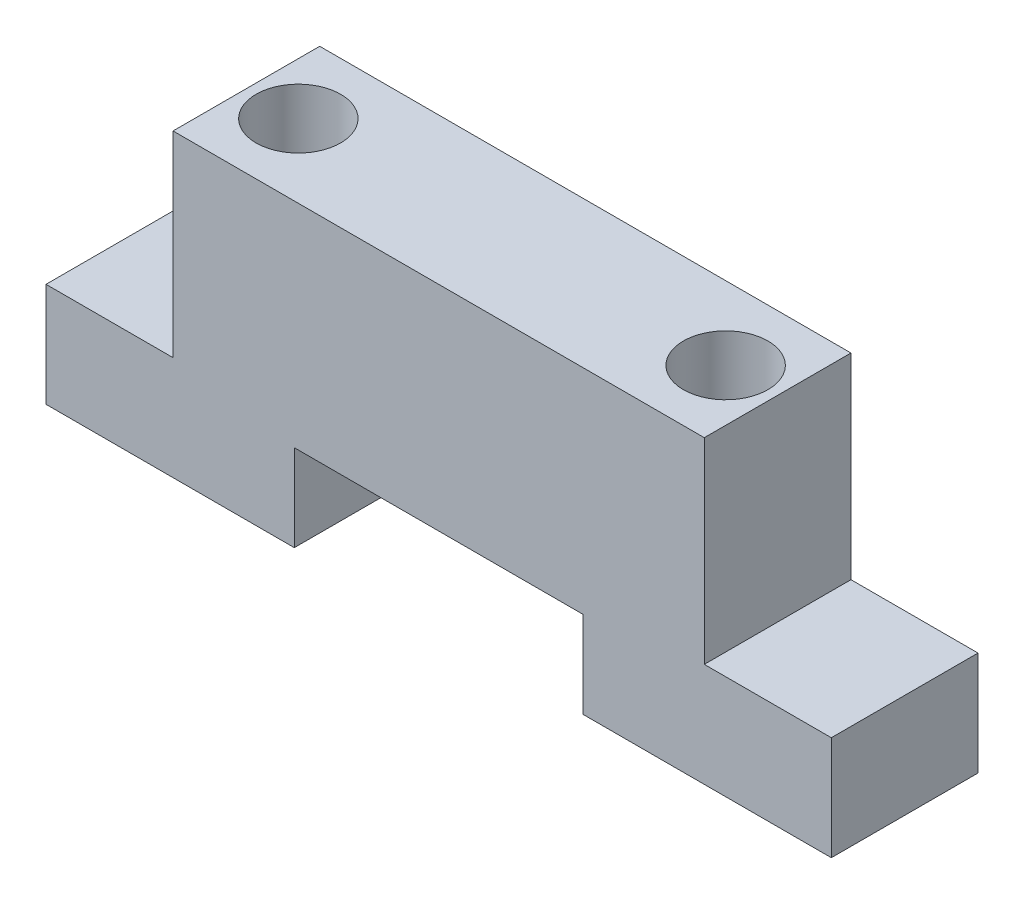
ISO-10303-21;
HEADER;
FILE_DESCRIPTION(('STEP AP214'),'2;1');
FILE_NAME('part.step','',(''),(''),'','','');
FILE_SCHEMA(('AUTOMOTIVE_DESIGN { 1 0 10303 214 1 1 1 1 }'));
ENDSEC;
DATA;
#1=APPLICATION_CONTEXT('core data for automotive mechanical design processes');
#2=APPLICATION_PROTOCOL_DEFINITION('international standard','automotive_design',2000,#1);
#3=PRODUCT_CONTEXT('',#1,'mechanical');
#4=PRODUCT('Part','Part','',(#3));
#5=PRODUCT_RELATED_PRODUCT_CATEGORY('part','',(#4));
#6=PRODUCT_DEFINITION_FORMATION('','',#4);
#7=PRODUCT_DEFINITION_CONTEXT('part definition',#1,'design');
#8=PRODUCT_DEFINITION('design','',#6,#7);
#9=PRODUCT_DEFINITION_SHAPE('','',#8);
#10=(LENGTH_UNIT() NAMED_UNIT(*) SI_UNIT(.MILLI.,.METRE.));
#11=(NAMED_UNIT(*) PLANE_ANGLE_UNIT() SI_UNIT($,.RADIAN.));
#12=(NAMED_UNIT(*) SI_UNIT($,.STERADIAN.) SOLID_ANGLE_UNIT());
#13=UNCERTAINTY_MEASURE_WITH_UNIT(LENGTH_MEASURE(1.E-05),#10,'distance_accuracy_value','');
#14=(GEOMETRIC_REPRESENTATION_CONTEXT(3) GLOBAL_UNCERTAINTY_ASSIGNED_CONTEXT((#13)) GLOBAL_UNIT_ASSIGNED_CONTEXT((#10,
#11,#12)) REPRESENTATION_CONTEXT('',''));
#15=CARTESIAN_POINT('',(0.,0.,0.));
#16=DIRECTION('',(0.,0.,1.));
#17=DIRECTION('',(1.,0.,0.));
#18=AXIS2_PLACEMENT_3D('',#15,#16,#17);
#19=CARTESIAN_POINT('',(10.75,0.,6.35));
#20=DIRECTION('',(0.,1.,0.));
#21=DIRECTION('',(-1.,0.,0.));
#22=AXIS2_PLACEMENT_3D('',#19,#20,#21);
#23=PLANE('',#22);
#24=CARTESIAN_POINT('',(7.75,0.,3.175));
#25=DIRECTION('',(0.,1.,0.));
#26=DIRECTION('',(0.,0.,1.));
#27=AXIS2_PLACEMENT_3D('',#24,#25,#26);
#28=CIRCLE('',#27,1.8288);
#29=CARTESIAN_POINT('',(7.75,0.,5.00379999999999));
#30=VERTEX_POINT('',#29);
#31=EDGE_CURVE('E158',#30,#30,#28,.T.);
#32=ORIENTED_EDGE('',*,*,#31,.T.);
#33=EDGE_LOOP('',(#32));
#34=FACE_BOUND('',#33,.T.);
#35=DIRECTION('',(1.,0.,0.));
#36=VECTOR('',#35,1.);
#37=CARTESIAN_POINT('',(10.75,0.,0.));
#38=LINE('',#37,#36);
#39=CARTESIAN_POINT('',(0.,0.,0.));
#40=VERTEX_POINT('',#39);
#41=CARTESIAN_POINT('',(10.75,0.,0.));
#42=VERTEX_POINT('',#41);
#43=EDGE_CURVE('E154',#40,#42,#38,.T.);
#44=ORIENTED_EDGE('',*,*,#43,.T.);
#45=DIRECTION('',(0.,0.,-1.));
#46=VECTOR('',#45,1.);
#47=CARTESIAN_POINT('',(10.75,0.,6.35));
#48=LINE('',#47,#46);
#49=CARTESIAN_POINT('',(10.75,0.,6.35));
#50=VERTEX_POINT('',#49);
#51=EDGE_CURVE('E11',#50,#42,#48,.T.);
#52=ORIENTED_EDGE('',*,*,#51,.F.);
#53=DIRECTION('',(1.,0.,0.));
#54=VECTOR('',#53,1.);
#55=CARTESIAN_POINT('',(10.75,0.,6.35));
#56=LINE('',#55,#54);
#57=CARTESIAN_POINT('',(0.,0.,6.35));
#58=VERTEX_POINT('',#57);
#59=EDGE_CURVE('E177',#58,#50,#56,.T.);
#60=ORIENTED_EDGE('',*,*,#59,.F.);
#61=DIRECTION('',(0.,0.,-1.));
#62=VECTOR('',#61,1.);
#63=CARTESIAN_POINT('',(0.,0.,6.35));
#64=LINE('',#63,#62);
#65=EDGE_CURVE('E150',#58,#40,#64,.T.);
#66=ORIENTED_EDGE('',*,*,#65,.T.);
#67=EDGE_LOOP('',(#44,#52,#60,#66));
#68=FACE_BOUND('',#67,.T.);
#69=ADVANCED_FACE('F34',(#34,#68),#23,.F.);
#70=CARTESIAN_POINT('',(10.75,3.75,6.35));
#71=DIRECTION('',(-1.,0.,0.));
#72=DIRECTION('',(0.,0.,1.));
#73=AXIS2_PLACEMENT_3D('',#70,#71,#72);
#74=PLANE('',#73);
#75=DIRECTION('',(0.,1.,0.));
#76=VECTOR('',#75,1.);
#77=CARTESIAN_POINT('',(10.75,3.75,0.));
#78=LINE('',#77,#76);
#79=CARTESIAN_POINT('',(10.75,3.75,0.));
#80=VERTEX_POINT('',#79);
#81=EDGE_CURVE('E157',#42,#80,#78,.T.);
#82=ORIENTED_EDGE('',*,*,#81,.T.);
#83=DIRECTION('',(0.,0.,-1.));
#84=VECTOR('',#83,1.);
#85=CARTESIAN_POINT('',(10.75,3.75,6.35));
#86=LINE('',#85,#84);
#87=CARTESIAN_POINT('',(10.75,3.75,6.35));
#88=VERTEX_POINT('',#87);
#89=EDGE_CURVE('E42',#88,#80,#86,.T.);
#90=ORIENTED_EDGE('',*,*,#89,.F.);
#91=DIRECTION('',(0.,1.,0.));
#92=VECTOR('',#91,1.);
#93=CARTESIAN_POINT('',(10.75,3.75,6.35));
#94=LINE('',#93,#92);
#95=EDGE_CURVE('E105',#50,#88,#94,.T.);
#96=ORIENTED_EDGE('',*,*,#95,.F.);
#97=ORIENTED_EDGE('',*,*,#51,.T.);
#98=EDGE_LOOP('',(#82,#90,#96,#97));
#99=FACE_BOUND('',#98,.T.);
#100=ADVANCED_FACE('F255',(#99),#74,.F.);
#101=CARTESIAN_POINT('',(10.75,3.75,6.35));
#102=DIRECTION('',(0.,1.,0.));
#103=DIRECTION('',(0.,0.,1.));
#104=AXIS2_PLACEMENT_3D('',#101,#102,#103);
#105=PLANE('',#104);
#106=DIRECTION('',(1.,0.,0.));
#107=VECTOR('',#106,1.);
#108=CARTESIAN_POINT('',(10.75,3.75,0.));
#109=LINE('',#108,#107);
#110=CARTESIAN_POINT('',(23.25,3.75,0.));
#111=VERTEX_POINT('',#110);
#112=EDGE_CURVE('E160',#80,#111,#109,.T.);
#113=ORIENTED_EDGE('',*,*,#112,.T.);
#114=DIRECTION('',(0.,0.,-1.));
#115=VECTOR('',#114,1.);
#116=CARTESIAN_POINT('',(23.25,3.75,6.35));
#117=LINE('',#116,#115);
#118=CARTESIAN_POINT('',(23.25,3.75,6.35));
#119=VERTEX_POINT('',#118);
#120=EDGE_CURVE('E196',#119,#111,#117,.T.);
#121=ORIENTED_EDGE('',*,*,#120,.F.);
#122=DIRECTION('',(1.,0.,0.));
#123=VECTOR('',#122,1.);
#124=CARTESIAN_POINT('',(10.75,3.75,6.35));
#125=LINE('',#124,#123);
#126=EDGE_CURVE('E204',#88,#119,#125,.T.);
#127=ORIENTED_EDGE('',*,*,#126,.F.);
#128=ORIENTED_EDGE('',*,*,#89,.T.);
#129=EDGE_LOOP('',(#113,#121,#127,#128));
#130=FACE_BOUND('',#129,.T.);
#131=ADVANCED_FACE('F202',(#130),#105,.F.);
#132=CARTESIAN_POINT('',(23.25,3.75,6.35));
#133=DIRECTION('',(1.,0.,0.));
#134=DIRECTION('',(0.,0.,-1.));
#135=AXIS2_PLACEMENT_3D('',#132,#133,#134);
#136=PLANE('',#135);
#137=DIRECTION('',(0.,-1.,0.));
#138=VECTOR('',#137,1.);
#139=CARTESIAN_POINT('',(23.25,3.75,0.));
#140=LINE('',#139,#138);
#141=CARTESIAN_POINT('',(23.25,0.,0.));
#142=VERTEX_POINT('',#141);
#143=EDGE_CURVE('E162',#111,#142,#140,.T.);
#144=ORIENTED_EDGE('',*,*,#143,.T.);
#145=DIRECTION('',(0.,0.,-1.));
#146=VECTOR('',#145,1.);
#147=CARTESIAN_POINT('',(23.25,0.,6.35));
#148=LINE('',#147,#146);
#149=CARTESIAN_POINT('',(23.25,0.,6.35));
#150=VERTEX_POINT('',#149);
#151=EDGE_CURVE('E193',#150,#142,#148,.T.);
#152=ORIENTED_EDGE('',*,*,#151,.F.);
#153=DIRECTION('',(0.,-1.,0.));
#154=VECTOR('',#153,1.);
#155=CARTESIAN_POINT('',(23.25,3.75,6.35));
#156=LINE('',#155,#154);
#157=EDGE_CURVE('E222',#119,#150,#156,.T.);
#158=ORIENTED_EDGE('',*,*,#157,.F.);
#159=ORIENTED_EDGE('',*,*,#120,.T.);
#160=EDGE_LOOP('',(#144,#152,#158,#159));
#161=FACE_BOUND('',#160,.T.);
#162=ADVANCED_FACE('F213',(#161),#136,.F.);
#163=CARTESIAN_POINT('',(34.,0.,6.35));
#164=DIRECTION('',(0.,1.,0.));
#165=DIRECTION('',(-1.,0.,0.));
#166=AXIS2_PLACEMENT_3D('',#163,#164,#165);
#167=PLANE('',#166);
#168=CARTESIAN_POINT('',(26.25,0.,3.175));
#169=DIRECTION('',(0.,1.,0.));
#170=DIRECTION('',(0.,0.,1.));
#171=AXIS2_PLACEMENT_3D('',#168,#169,#170);
#172=CIRCLE('',#171,1.8288);
#173=CARTESIAN_POINT('',(26.25,0.,5.00379999999999));
#174=VERTEX_POINT('',#173);
#175=EDGE_CURVE('E266',#174,#174,#172,.T.);
#176=ORIENTED_EDGE('',*,*,#175,.T.);
#177=EDGE_LOOP('',(#176));
#178=FACE_BOUND('',#177,.T.);
#179=DIRECTION('',(1.,0.,0.));
#180=VECTOR('',#179,1.);
#181=CARTESIAN_POINT('',(34.,0.,0.));
#182=LINE('',#181,#180);
#183=CARTESIAN_POINT('',(34.,0.,0.));
#184=VERTEX_POINT('',#183);
#185=EDGE_CURVE('E164',#142,#184,#182,.T.);
#186=ORIENTED_EDGE('',*,*,#185,.T.);
#187=DIRECTION('',(0.,0.,-1.));
#188=VECTOR('',#187,1.);
#189=CARTESIAN_POINT('',(34.,0.,6.35));
#190=LINE('',#189,#188);
#191=CARTESIAN_POINT('',(34.,0.,6.35));
#192=VERTEX_POINT('',#191);
#193=EDGE_CURVE('E190',#192,#184,#190,.T.);
#194=ORIENTED_EDGE('',*,*,#193,.F.);
#195=DIRECTION('',(1.,0.,0.));
#196=VECTOR('',#195,1.);
#197=CARTESIAN_POINT('',(34.,0.,6.35));
#198=LINE('',#197,#196);
#199=EDGE_CURVE('E219',#150,#192,#198,.T.);
#200=ORIENTED_EDGE('',*,*,#199,.F.);
#201=ORIENTED_EDGE('',*,*,#151,.T.);
#202=EDGE_LOOP('',(#186,#194,#200,#201));
#203=FACE_BOUND('',#202,.T.);
#204=ADVANCED_FACE('F217',(#178,#203),#167,.F.);
#205=CARTESIAN_POINT('',(34.,4.5,6.35));
#206=DIRECTION('',(-1.,0.,0.));
#207=DIRECTION('',(0.,0.,1.));
#208=AXIS2_PLACEMENT_3D('',#205,#206,#207);
#209=PLANE('',#208);
#210=DIRECTION('',(0.,1.,0.));
#211=VECTOR('',#210,1.);
#212=CARTESIAN_POINT('',(34.,4.5,0.));
#213=LINE('',#212,#211);
#214=CARTESIAN_POINT('',(34.,4.5,0.));
#215=VERTEX_POINT('',#214);
#216=EDGE_CURVE('E166',#184,#215,#213,.T.);
#217=ORIENTED_EDGE('',*,*,#216,.T.);
#218=DIRECTION('',(0.,0.,-1.));
#219=VECTOR('',#218,1.);
#220=CARTESIAN_POINT('',(34.,4.5,6.35));
#221=LINE('',#220,#219);
#222=CARTESIAN_POINT('',(34.,4.5,6.35));
#223=VERTEX_POINT('',#222);
#224=EDGE_CURVE('E187',#223,#215,#221,.T.);
#225=ORIENTED_EDGE('',*,*,#224,.F.);
#226=DIRECTION('',(0.,1.,0.));
#227=VECTOR('',#226,1.);
#228=CARTESIAN_POINT('',(34.,4.5,6.35));
#229=LINE('',#228,#227);
#230=EDGE_CURVE('E221',#192,#223,#229,.T.);
#231=ORIENTED_EDGE('',*,*,#230,.F.);
#232=ORIENTED_EDGE('',*,*,#193,.T.);
#233=EDGE_LOOP('',(#217,#225,#231,#232));
#234=FACE_BOUND('',#233,.T.);
#235=ADVANCED_FACE('F336',(#234),#209,.F.);
#236=CARTESIAN_POINT('',(28.5,4.5,6.35));
#237=DIRECTION('',(0.,-1.,0.));
#238=DIRECTION('',(1.,0.,0.));
#239=AXIS2_PLACEMENT_3D('',#236,#237,#238);
#240=PLANE('',#239);
#241=DIRECTION('',(-1.,0.,0.));
#242=VECTOR('',#241,1.);
#243=CARTESIAN_POINT('',(28.5,4.5,0.));
#244=LINE('',#243,#242);
#245=CARTESIAN_POINT('',(28.5,4.5,0.));
#246=VERTEX_POINT('',#245);
#247=EDGE_CURVE('E168',#215,#246,#244,.T.);
#248=ORIENTED_EDGE('',*,*,#247,.T.);
#249=DIRECTION('',(0.,0.,-1.));
#250=VECTOR('',#249,1.);
#251=CARTESIAN_POINT('',(28.5,4.5,6.35));
#252=LINE('',#251,#250);
#253=CARTESIAN_POINT('',(28.5,4.5,6.35));
#254=VERTEX_POINT('',#253);
#255=EDGE_CURVE('E184',#254,#246,#252,.T.);
#256=ORIENTED_EDGE('',*,*,#255,.F.);
#257=DIRECTION('',(-1.,0.,0.));
#258=VECTOR('',#257,1.);
#259=CARTESIAN_POINT('',(28.5,4.5,6.35));
#260=LINE('',#259,#258);
#261=EDGE_CURVE('E224',#223,#254,#260,.T.);
#262=ORIENTED_EDGE('',*,*,#261,.F.);
#263=ORIENTED_EDGE('',*,*,#224,.T.);
#264=EDGE_LOOP('',(#248,#256,#262,#263));
#265=FACE_BOUND('',#264,.T.);
#266=ADVANCED_FACE('F327',(#265),#240,.F.);
#267=CARTESIAN_POINT('',(28.5,13.,6.35));
#268=DIRECTION('',(-1.,0.,0.));
#269=DIRECTION('',(0.,0.,1.));
#270=AXIS2_PLACEMENT_3D('',#267,#268,#269);
#271=PLANE('',#270);
#272=DIRECTION('',(0.,1.,0.));
#273=VECTOR('',#272,1.);
#274=CARTESIAN_POINT('',(28.5,13.,0.));
#275=LINE('',#274,#273);
#276=CARTESIAN_POINT('',(28.5,13.,0.));
#277=VERTEX_POINT('',#276);
#278=EDGE_CURVE('E170',#246,#277,#275,.T.);
#279=ORIENTED_EDGE('',*,*,#278,.T.);
#280=DIRECTION('',(0.,0.,-1.));
#281=VECTOR('',#280,1.);
#282=CARTESIAN_POINT('',(28.5,13.,6.35));
#283=LINE('',#282,#281);
#284=CARTESIAN_POINT('',(28.5,13.,6.35));
#285=VERTEX_POINT('',#284);
#286=EDGE_CURVE('E181',#285,#277,#283,.T.);
#287=ORIENTED_EDGE('',*,*,#286,.F.);
#288=DIRECTION('',(0.,1.,0.));
#289=VECTOR('',#288,1.);
#290=CARTESIAN_POINT('',(28.5,13.,6.35));
#291=LINE('',#290,#289);
#292=EDGE_CURVE('E230',#254,#285,#291,.T.);
#293=ORIENTED_EDGE('',*,*,#292,.F.);
#294=ORIENTED_EDGE('',*,*,#255,.T.);
#295=EDGE_LOOP('',(#279,#287,#293,#294));
#296=FACE_BOUND('',#295,.T.);
#297=ADVANCED_FACE('F236',(#296),#271,.F.);
#298=CARTESIAN_POINT('',(5.5,13.,6.35));
#299=DIRECTION('',(0.,-1.,0.));
#300=DIRECTION('',(0.,0.,-1.));
#301=AXIS2_PLACEMENT_3D('',#298,#299,#300);
#302=PLANE('',#301);
#303=CARTESIAN_POINT('',(26.25,13.,3.175));
#304=DIRECTION('',(0.,1.,0.));
#305=DIRECTION('',(0.,0.,1.));
#306=AXIS2_PLACEMENT_3D('',#303,#304,#305);
#307=CIRCLE('',#306,1.8288);
#308=CARTESIAN_POINT('',(26.25,13.,5.0038));
#309=VERTEX_POINT('',#308);
#310=EDGE_CURVE('E273',#309,#309,#307,.T.);
#311=ORIENTED_EDGE('',*,*,#310,.F.);
#312=EDGE_LOOP('',(#311));
#313=FACE_BOUND('',#312,.T.);
#314=CARTESIAN_POINT('',(7.75,13.,3.175));
#315=DIRECTION('',(0.,1.,0.));
#316=DIRECTION('',(0.,0.,1.));
#317=AXIS2_PLACEMENT_3D('',#314,#315,#316);
#318=CIRCLE('',#317,1.8288);
#319=CARTESIAN_POINT('',(7.75,13.,5.0038));
#320=VERTEX_POINT('',#319);
#321=EDGE_CURVE('E263',#320,#320,#318,.T.);
#322=ORIENTED_EDGE('',*,*,#321,.F.);
#323=EDGE_LOOP('',(#322));
#324=FACE_BOUND('',#323,.T.);
#325=DIRECTION('',(-1.,0.,0.));
#326=VECTOR('',#325,1.);
#327=CARTESIAN_POINT('',(5.5,13.,0.));
#328=LINE('',#327,#326);
#329=CARTESIAN_POINT('',(5.5,13.,0.));
#330=VERTEX_POINT('',#329);
#331=EDGE_CURVE('E172',#277,#330,#328,.T.);
#332=ORIENTED_EDGE('',*,*,#331,.T.);
#333=DIRECTION('',(0.,0.,-1.));
#334=VECTOR('',#333,1.);
#335=CARTESIAN_POINT('',(5.5,13.,6.35));
#336=LINE('',#335,#334);
#337=CARTESIAN_POINT('',(5.5,13.,6.35));
#338=VERTEX_POINT('',#337);
#339=EDGE_CURVE('E145',#338,#330,#336,.T.);
#340=ORIENTED_EDGE('',*,*,#339,.F.);
#341=DIRECTION('',(-1.,0.,0.));
#342=VECTOR('',#341,1.);
#343=CARTESIAN_POINT('',(5.5,13.,6.35));
#344=LINE('',#343,#342);
#345=EDGE_CURVE('E136',#285,#338,#344,.T.);
#346=ORIENTED_EDGE('',*,*,#345,.F.);
#347=ORIENTED_EDGE('',*,*,#286,.T.);
#348=EDGE_LOOP('',(#332,#340,#346,#347));
#349=FACE_BOUND('',#348,.T.);
#350=ADVANCED_FACE('F240',(#313,#324,#349),#302,.F.);
#351=CARTESIAN_POINT('',(5.5,4.5,6.35));
#352=DIRECTION('',(1.,0.,0.));
#353=DIRECTION('',(0.,0.,-1.));
#354=AXIS2_PLACEMENT_3D('',#351,#352,#353);
#355=PLANE('',#354);
#356=DIRECTION('',(0.,-1.,0.));
#357=VECTOR('',#356,1.);
#358=CARTESIAN_POINT('',(5.5,4.5,0.));
#359=LINE('',#358,#357);
#360=CARTESIAN_POINT('',(5.5,4.5,0.));
#361=VERTEX_POINT('',#360);
#362=EDGE_CURVE('E144',#330,#361,#359,.T.);
#363=ORIENTED_EDGE('',*,*,#362,.T.);
#364=DIRECTION('',(0.,0.,-1.));
#365=VECTOR('',#364,1.);
#366=CARTESIAN_POINT('',(5.5,4.5,6.35));
#367=LINE('',#366,#365);
#368=CARTESIAN_POINT('',(5.5,4.5,6.35));
#369=VERTEX_POINT('',#368);
#370=EDGE_CURVE('E141',#369,#361,#367,.T.);
#371=ORIENTED_EDGE('',*,*,#370,.F.);
#372=DIRECTION('',(0.,-1.,0.));
#373=VECTOR('',#372,1.);
#374=CARTESIAN_POINT('',(5.5,4.5,6.35));
#375=LINE('',#374,#373);
#376=EDGE_CURVE('E130',#338,#369,#375,.T.);
#377=ORIENTED_EDGE('',*,*,#376,.F.);
#378=ORIENTED_EDGE('',*,*,#339,.T.);
#379=EDGE_LOOP('',(#363,#371,#377,#378));
#380=FACE_BOUND('',#379,.T.);
#381=ADVANCED_FACE('F142',(#380),#355,.F.);
#382=CARTESIAN_POINT('',(0.,4.5,6.35));
#383=DIRECTION('',(0.,-1.,0.));
#384=DIRECTION('',(1.,0.,0.));
#385=AXIS2_PLACEMENT_3D('',#382,#383,#384);
#386=PLANE('',#385);
#387=DIRECTION('',(-1.,0.,0.));
#388=VECTOR('',#387,1.);
#389=CARTESIAN_POINT('',(0.,4.5,0.));
#390=LINE('',#389,#388);
#391=CARTESIAN_POINT('',(0.,4.5,0.));
#392=VERTEX_POINT('',#391);
#393=EDGE_CURVE('E91',#361,#392,#390,.T.);
#394=ORIENTED_EDGE('',*,*,#393,.T.);
#395=DIRECTION('',(0.,0.,-1.));
#396=VECTOR('',#395,1.);
#397=CARTESIAN_POINT('',(0.,4.5,6.35));
#398=LINE('',#397,#396);
#399=CARTESIAN_POINT('',(0.,4.5,6.35));
#400=VERTEX_POINT('',#399);
#401=EDGE_CURVE('E146',#400,#392,#398,.T.);
#402=ORIENTED_EDGE('',*,*,#401,.F.);
#403=DIRECTION('',(-1.,0.,0.));
#404=VECTOR('',#403,1.);
#405=CARTESIAN_POINT('',(0.,4.5,6.35));
#406=LINE('',#405,#404);
#407=EDGE_CURVE('E134',#369,#400,#406,.T.);
#408=ORIENTED_EDGE('',*,*,#407,.F.);
#409=ORIENTED_EDGE('',*,*,#370,.T.);
#410=EDGE_LOOP('',(#394,#402,#408,#409));
#411=FACE_BOUND('',#410,.T.);
#412=ADVANCED_FACE('F148',(#411),#386,.F.);
#413=CARTESIAN_POINT('',(0.,0.,6.35));
#414=DIRECTION('',(1.,0.,0.));
#415=DIRECTION('',(0.,0.,-1.));
#416=AXIS2_PLACEMENT_3D('',#413,#414,#415);
#417=PLANE('',#416);
#418=DIRECTION('',(0.,-1.,0.));
#419=VECTOR('',#418,1.);
#420=CARTESIAN_POINT('',(0.,0.,0.));
#421=LINE('',#420,#419);
#422=EDGE_CURVE('E97',#392,#40,#421,.T.);
#423=ORIENTED_EDGE('',*,*,#422,.T.);
#424=ORIENTED_EDGE('',*,*,#65,.F.);
#425=DIRECTION('',(0.,-1.,0.));
#426=VECTOR('',#425,1.);
#427=CARTESIAN_POINT('',(0.,0.,6.35));
#428=LINE('',#427,#426);
#429=EDGE_CURVE('E50',#400,#58,#428,.T.);
#430=ORIENTED_EDGE('',*,*,#429,.F.);
#431=ORIENTED_EDGE('',*,*,#401,.T.);
#432=EDGE_LOOP('',(#423,#424,#430,#431));
#433=FACE_BOUND('',#432,.T.);
#434=ADVANCED_FACE('F244',(#433),#417,.F.);
#435=CARTESIAN_POINT('',(0.,0.,6.35));
#436=DIRECTION('',(0.,0.,-1.));
#437=DIRECTION('',(-1.,0.,0.));
#438=AXIS2_PLACEMENT_3D('',#435,#436,#437);
#439=PLANE('',#438);
#440=ORIENTED_EDGE('',*,*,#59,.T.);
#441=ORIENTED_EDGE('',*,*,#95,.T.);
#442=ORIENTED_EDGE('',*,*,#126,.T.);
#443=ORIENTED_EDGE('',*,*,#157,.T.);
#444=ORIENTED_EDGE('',*,*,#199,.T.);
#445=ORIENTED_EDGE('',*,*,#230,.T.);
#446=ORIENTED_EDGE('',*,*,#261,.T.);
#447=ORIENTED_EDGE('',*,*,#292,.T.);
#448=ORIENTED_EDGE('',*,*,#345,.T.);
#449=ORIENTED_EDGE('',*,*,#376,.T.);
#450=ORIENTED_EDGE('',*,*,#407,.T.);
#451=ORIENTED_EDGE('',*,*,#429,.T.);
#452=EDGE_LOOP('',(#440,#441,#442,#443,#444,#445,#446,#447,#448,#449,#450,#451));
#453=FACE_BOUND('',#452,.T.);
#454=ADVANCED_FACE('F132',(#453),#439,.F.);
#455=CARTESIAN_POINT('',(0.,0.,0.));
#456=DIRECTION('',(0.,0.,-1.));
#457=DIRECTION('',(-1.,0.,0.));
#458=AXIS2_PLACEMENT_3D('',#455,#456,#457);
#459=PLANE('',#458);
#460=ORIENTED_EDGE('',*,*,#43,.F.);
#461=ORIENTED_EDGE('',*,*,#422,.F.);
#462=ORIENTED_EDGE('',*,*,#393,.F.);
#463=ORIENTED_EDGE('',*,*,#362,.F.);
#464=ORIENTED_EDGE('',*,*,#331,.F.);
#465=ORIENTED_EDGE('',*,*,#278,.F.);
#466=ORIENTED_EDGE('',*,*,#247,.F.);
#467=ORIENTED_EDGE('',*,*,#216,.F.);
#468=ORIENTED_EDGE('',*,*,#185,.F.);
#469=ORIENTED_EDGE('',*,*,#143,.F.);
#470=ORIENTED_EDGE('',*,*,#112,.F.);
#471=ORIENTED_EDGE('',*,*,#81,.F.);
#472=EDGE_LOOP('',(#460,#461,#462,#463,#464,#465,#466,#467,#468,#469,#470,#471));
#473=FACE_BOUND('',#472,.T.);
#474=ADVANCED_FACE('F208',(#473),#459,.T.);
#475=CARTESIAN_POINT('',(7.75,13.,3.175));
#476=DIRECTION('',(0.,1.,0.));
#477=DIRECTION('',(0.,0.,1.));
#478=AXIS2_PLACEMENT_3D('',#475,#476,#477);
#479=CYLINDRICAL_SURFACE('',#478,1.8288);
#480=ORIENTED_EDGE('',*,*,#31,.F.);
#481=EDGE_LOOP('',(#480));
#482=FACE_BOUND('',#481,.T.);
#483=ORIENTED_EDGE('',*,*,#321,.T.);
#484=EDGE_LOOP('',(#483));
#485=FACE_BOUND('',#484,.T.);
#486=ADVANCED_FACE('F284',(#482,#485),#479,.F.);
#487=CARTESIAN_POINT('',(26.25,13.,3.175));
#488=DIRECTION('',(0.,1.,0.));
#489=DIRECTION('',(0.,0.,1.));
#490=AXIS2_PLACEMENT_3D('',#487,#488,#489);
#491=CYLINDRICAL_SURFACE('',#490,1.8288);
#492=ORIENTED_EDGE('',*,*,#175,.F.);
#493=EDGE_LOOP('',(#492));
#494=FACE_BOUND('',#493,.T.);
#495=ORIENTED_EDGE('',*,*,#310,.T.);
#496=EDGE_LOOP('',(#495));
#497=FACE_BOUND('',#496,.T.);
#498=ADVANCED_FACE('F277',(#494,#497),#491,.F.);
#499=CLOSED_SHELL('',(#69,#100,#131,#162,#204,#235,#266,#297,#350,#381,#412,#434,#454,#474,#486,#498));
#500=MANIFOLD_SOLID_BREP('B2',#499);
#501=ADVANCED_BREP_SHAPE_REPRESENTATION('',(#18,#500),#14);
#502=SHAPE_DEFINITION_REPRESENTATION(#9,#501);
ENDSEC;
END-ISO-10303-21;
